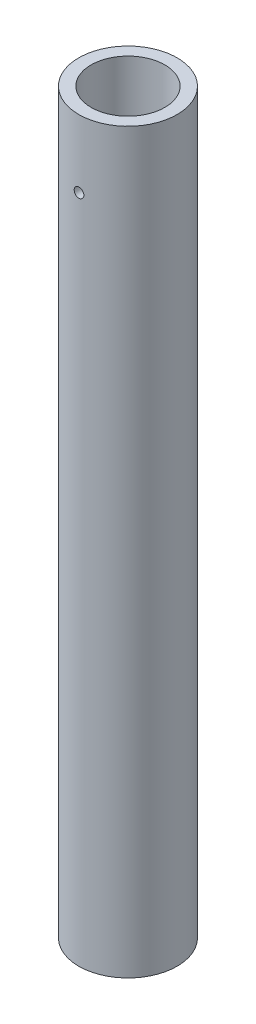
ISO-10303-21;
HEADER;
FILE_DESCRIPTION(('STEP AP214'),'2;1');
FILE_NAME('part.step','',(''),(''),'','','');
FILE_SCHEMA(('AUTOMOTIVE_DESIGN { 1 0 10303 214 1 1 1 1 }'));
ENDSEC;
DATA;
#1=APPLICATION_CONTEXT('core data for automotive mechanical design processes');
#2=APPLICATION_PROTOCOL_DEFINITION('international standard','automotive_design',2000,#1);
#3=PRODUCT_CONTEXT('',#1,'mechanical');
#4=PRODUCT('Part','Part','',(#3));
#5=PRODUCT_RELATED_PRODUCT_CATEGORY('part','',(#4));
#6=PRODUCT_DEFINITION_FORMATION('','',#4);
#7=PRODUCT_DEFINITION_CONTEXT('part definition',#1,'design');
#8=PRODUCT_DEFINITION('design','',#6,#7);
#9=PRODUCT_DEFINITION_SHAPE('','',#8);
#10=(LENGTH_UNIT() NAMED_UNIT(*) SI_UNIT(.MILLI.,.METRE.));
#11=(NAMED_UNIT(*) PLANE_ANGLE_UNIT() SI_UNIT($,.RADIAN.));
#12=(NAMED_UNIT(*) SI_UNIT($,.STERADIAN.) SOLID_ANGLE_UNIT());
#13=UNCERTAINTY_MEASURE_WITH_UNIT(LENGTH_MEASURE(1.E-05),#10,'distance_accuracy_value','');
#14=(GEOMETRIC_REPRESENTATION_CONTEXT(3) GLOBAL_UNCERTAINTY_ASSIGNED_CONTEXT((#13)) GLOBAL_UNIT_ASSIGNED_CONTEXT((#10,
#11,#12)) REPRESENTATION_CONTEXT('',''));
#15=CARTESIAN_POINT('',(0.,0.,0.));
#16=DIRECTION('',(0.,0.,1.));
#17=DIRECTION('',(1.,0.,0.));
#18=AXIS2_PLACEMENT_3D('',#15,#16,#17);
#19=CARTESIAN_POINT('',(0.,152.4,0.));
#20=DIRECTION('',(0.,1.,0.));
#21=DIRECTION('',(0.,0.,1.));
#22=AXIS2_PLACEMENT_3D('',#19,#20,#21);
#23=PLANE('',#22);
#24=CARTESIAN_POINT('',(0.,152.4,0.));
#25=DIRECTION('',(0.,1.,0.));
#26=DIRECTION('',(0.,0.,1.));
#27=AXIS2_PLACEMENT_3D('',#24,#25,#26);
#28=CIRCLE('',#27,10.16);
#29=CARTESIAN_POINT('',(0.,152.4,10.16));
#30=VERTEX_POINT('',#29);
#31=EDGE_CURVE('E158',#30,#30,#28,.T.);
#32=ORIENTED_EDGE('',*,*,#31,.T.);
#33=EDGE_LOOP('',(#32));
#34=FACE_BOUND('',#33,.T.);
#35=CARTESIAN_POINT('',(0.,152.4,0.));
#36=DIRECTION('',(0.,1.,0.));
#37=DIRECTION('',(0.,0.,1.));
#38=AXIS2_PLACEMENT_3D('',#35,#36,#37);
#39=CIRCLE('',#38,7.62);
#40=CARTESIAN_POINT('',(0.,152.4,7.62));
#41=VERTEX_POINT('',#40);
#42=EDGE_CURVE('E168',#41,#41,#39,.T.);
#43=ORIENTED_EDGE('',*,*,#42,.F.);
#44=EDGE_LOOP('',(#43));
#45=FACE_BOUND('',#44,.T.);
#46=ADVANCED_FACE('F42',(#34,#45),#23,.T.);
#47=CARTESIAN_POINT('',(0.,0.,0.));
#48=DIRECTION('',(0.,1.,0.));
#49=DIRECTION('',(0.,0.,1.));
#50=AXIS2_PLACEMENT_3D('',#47,#48,#49);
#51=PLANE('',#50);
#52=CARTESIAN_POINT('',(0.,0.,0.));
#53=DIRECTION('',(0.,1.,0.));
#54=DIRECTION('',(0.,0.,1.));
#55=AXIS2_PLACEMENT_3D('',#52,#53,#54);
#56=CIRCLE('',#55,10.16);
#57=CARTESIAN_POINT('',(0.,0.,10.16));
#58=VERTEX_POINT('',#57);
#59=EDGE_CURVE('E164',#58,#58,#56,.T.);
#60=ORIENTED_EDGE('',*,*,#59,.F.);
#61=EDGE_LOOP('',(#60));
#62=FACE_BOUND('',#61,.T.);
#63=CARTESIAN_POINT('',(0.,0.,0.));
#64=DIRECTION('',(0.,1.,0.));
#65=DIRECTION('',(0.,0.,1.));
#66=AXIS2_PLACEMENT_3D('',#63,#64,#65);
#67=CIRCLE('',#66,7.62);
#68=CARTESIAN_POINT('',(0.,0.,7.62));
#69=VERTEX_POINT('',#68);
#70=EDGE_CURVE('E171',#69,#69,#67,.T.);
#71=ORIENTED_EDGE('',*,*,#70,.T.);
#72=EDGE_LOOP('',(#71));
#73=FACE_BOUND('',#72,.T.);
#74=ADVANCED_FACE('F180',(#62,#73),#51,.F.);
#75=CARTESIAN_POINT('',(0.,152.4,0.));
#76=DIRECTION('',(0.,-1.,0.));
#77=DIRECTION('',(0.,0.,-1.));
#78=AXIS2_PLACEMENT_3D('',#75,#76,#77);
#79=CYLINDRICAL_SURFACE('',#78,10.16);
#80=DIRECTION('',(0.,-1.,0.));
#81=VECTOR('',#80,1.);
#82=CARTESIAN_POINT('',(2.53999999999999,152.4,-9.83737769936684));
#83=LINE('',#82,#81);
#84=CARTESIAN_POINT('',(2.54,45.0577550256016,-9.83737769936684));
#85=VERTEX_POINT('',#84);
#86=CARTESIAN_POINT('',(2.54,70.4577550256015,-9.83737769936684));
#87=VERTEX_POINT('',#86);
#88=EDGE_CURVE('E92',#85,#87,#83,.F.);
#89=ORIENTED_EDGE('',*,*,#88,.T.);
#90=CARTESIAN_POINT('',(0.,70.4577550256015,0.));
#91=DIRECTION('',(0.,1.,0.));
#92=DIRECTION('',(0.,0.,1.));
#93=AXIS2_PLACEMENT_3D('',#90,#91,#92);
#94=CIRCLE('',#93,10.16);
#95=CARTESIAN_POINT('',(-2.54,70.4577550256015,-9.83737769936684));
#96=VERTEX_POINT('',#95);
#97=EDGE_CURVE('E104',#87,#96,#94,.T.);
#98=ORIENTED_EDGE('',*,*,#97,.T.);
#99=DIRECTION('',(0.,-1.,0.));
#100=VECTOR('',#99,1.);
#101=CARTESIAN_POINT('',(-2.53999999999999,152.4,-9.83737769936684));
#102=LINE('',#101,#100);
#103=CARTESIAN_POINT('',(-2.54,45.0577550256016,-9.83737769936684));
#104=VERTEX_POINT('',#103);
#105=EDGE_CURVE('E98',#96,#104,#102,.T.);
#106=ORIENTED_EDGE('',*,*,#105,.T.);
#107=CARTESIAN_POINT('',(0.,45.0577550256016,0.));
#108=DIRECTION('',(0.,-1.,0.));
#109=DIRECTION('',(0.,0.,-1.));
#110=AXIS2_PLACEMENT_3D('',#107,#108,#109);
#111=CIRCLE('',#110,10.16);
#112=EDGE_CURVE('E83',#104,#85,#111,.T.);
#113=ORIENTED_EDGE('',*,*,#112,.T.);
#114=EDGE_LOOP('',(#89,#98,#106,#113));
#115=FACE_BOUND('',#114,.T.);
#116=CARTESIAN_POINT('',(0.,139.43,-10.16));
#117=CARTESIAN_POINT('',(-0.0560250261157726,139.429997571628,-10.1599993643014));
#118=CARTESIAN_POINT('',(-0.112087205430035,139.425275944608,-10.1595316682345));
#119=CARTESIAN_POINT('',(-0.222657622275252,139.406511546825,-10.1577109084441));
#120=CARTESIAN_POINT('',(-0.277164073361569,139.392458477049,-10.1563568664937));
#121=CARTESIAN_POINT('',(-0.383005831709282,139.355443983099,-10.1529162789638));
#122=CARTESIAN_POINT('',(-0.434343020475558,139.332487904516,-10.1508301730054));
#123=CARTESIAN_POINT('',(-0.532424286024198,139.278329326082,-10.1461587902314));
#124=CARTESIAN_POINT('',(-0.579169280632964,139.247128478704,-10.143573613471));
#125=CARTESIAN_POINT('',(-0.66691376112447,139.177249059511,-10.1381836351593));
#126=CARTESIAN_POINT('',(-0.707894966705325,139.138547582446,-10.1353781769401));
#127=CARTESIAN_POINT('',(-0.782791472996865,139.054814310853,-10.1298692664587));
#128=CARTESIAN_POINT('',(-0.816706448607081,139.00978222523,-10.1271658188946));
#129=CARTESIAN_POINT('',(-0.876572239315846,138.914551978713,-10.1221602761381));
#130=CARTESIAN_POINT('',(-0.902506558443179,138.864343400069,-10.1198590164493));
#131=CARTESIAN_POINT('',(-0.945569519703623,138.760257678527,-10.115926483827));
#132=CARTESIAN_POINT('',(-0.962698373017576,138.706380623646,-10.114295194826));
#133=CARTESIAN_POINT('',(-0.987610096586675,138.596673444315,-10.1118931970649));
#134=CARTESIAN_POINT('',(-0.995423234589245,138.540850254936,-10.1111197018178));
#135=CARTESIAN_POINT('',(-1.00157529857259,138.428679916967,-10.1105122022756));
#136=CARTESIAN_POINT('',(-0.999914466277741,138.372332781782,-10.1106781740105));
#137=CARTESIAN_POINT('',(-0.987190689058772,138.260922561255,-10.1119283125346));
#138=CARTESIAN_POINT('',(-0.976160776776338,138.205855662084,-10.1130092533631));
#139=CARTESIAN_POINT('',(-0.945063328277174,138.098358463532,-10.1159624936836));
#140=CARTESIAN_POINT('',(-0.92499567341003,138.045928198777,-10.1178348035648));
#141=CARTESIAN_POINT('',(-0.876355871770824,137.945088130312,-10.1221635314666));
#142=CARTESIAN_POINT('',(-0.847769052703529,137.896685448676,-10.1246209557318));
#143=CARTESIAN_POINT('',(-0.782912944205676,137.805352451354,-10.1298421629858));
#144=CARTESIAN_POINT('',(-0.746643436988559,137.762422290857,-10.1326059546583));
#145=CARTESIAN_POINT('',(-0.667266935808773,137.683061002315,-10.1381428586994));
#146=CARTESIAN_POINT('',(-0.624131411076059,137.646658403674,-10.1409159604841));
#147=CARTESIAN_POINT('',(-0.532346452083306,137.581606644803,-10.1461478722502));
#148=CARTESIAN_POINT('',(-0.483697011930568,137.552957492859,-10.1486066818957));
#149=CARTESIAN_POINT('',(-0.382245559787237,137.504227080501,-10.152933739007));
#150=CARTESIAN_POINT('',(-0.329442857077843,137.484147248812,-10.154801887981));
#151=CARTESIAN_POINT('',(-0.221192992155678,137.453146283328,-10.1577361159729));
#152=CARTESIAN_POINT('',(-0.165745906595768,137.442224884228,-10.1588022182249));
#153=CARTESIAN_POINT('',(-0.0540283040116495,137.429886952227,-10.1600092469116));
#154=CARTESIAN_POINT('',(0.00223782510741885,137.428431046945,-10.1601540056859));
#155=CARTESIAN_POINT('',(0.114213296595047,137.434962047263,-10.1595123089037));
#156=CARTESIAN_POINT('',(0.169922646237134,137.442948829344,-10.1587258655282));
#157=CARTESIAN_POINT('',(0.279089675299401,137.468105828399,-10.1563126020596));
#158=CARTESIAN_POINT('',(0.332551639022963,137.485257629292,-10.1546874674458));
#159=CARTESIAN_POINT('',(0.435839434129006,137.528238875258,-10.1507791649535));
#160=CARTESIAN_POINT('',(0.485665186377301,137.554068509116,-10.1484959827593));
#161=CARTESIAN_POINT('',(0.580444321850738,137.613769988661,-10.1435174846501));
#162=CARTESIAN_POINT('',(0.625381326597634,137.647667724463,-10.1408208521173));
#163=CARTESIAN_POINT('',(0.708941626585569,137.722506025058,-10.1353223279493));
#164=CARTESIAN_POINT('',(0.747564768343615,137.763446761008,-10.1325204337574));
#165=CARTESIAN_POINT('',(0.817537510244529,137.851380602453,-10.1271156660811));
#166=CARTESIAN_POINT('',(0.848861285245363,137.898394309157,-10.1245135204383));
#167=CARTESIAN_POINT('',(0.903168639474859,137.997037837922,-10.1198138614828));
#168=CARTESIAN_POINT('',(0.926152329664966,138.048667598557,-10.1177163414563));
#169=CARTESIAN_POINT('',(0.963083780642945,138.154988795494,-10.1142679139783));
#170=CARTESIAN_POINT('',(0.977046952614755,138.209674835616,-10.1129157337279));
#171=CARTESIAN_POINT('',(0.995591025077967,138.320629230264,-10.1111070959364));
#172=CARTESIAN_POINT('',(1.00017218549786,138.376897540911,-10.11065061358));
#173=CARTESIAN_POINT('',(0.999818647500243,138.489162544836,-10.1106855606105));
#174=CARTESIAN_POINT('',(0.994924517879189,138.545159371555,-10.1111729487841));
#175=CARTESIAN_POINT('',(0.97584433948834,138.655531266459,-10.1130321064371));
#176=CARTESIAN_POINT('',(0.961658279838914,138.709906332744,-10.1144038769521));
#177=CARTESIAN_POINT('',(0.924408033562373,138.815491188644,-10.1178761196795));
#178=CARTESIAN_POINT('',(0.901344991743544,138.866701385424,-10.1199764979246));
#179=CARTESIAN_POINT('',(0.846999671719266,138.964530274758,-10.1246694842275));
#180=CARTESIAN_POINT('',(0.815717447961337,139.011148997725,-10.1272620890245));
#181=CARTESIAN_POINT('',(0.745669361165865,139.098679504877,-10.1326606952461));
#182=CARTESIAN_POINT('',(0.706873281046854,139.139567056382,-10.1354675296104));
#183=CARTESIAN_POINT('',(0.62295817324678,139.214269716208,-10.1409707252067));
#184=CARTESIAN_POINT('',(0.577837631731866,139.248083126407,-10.143667059789));
#185=CARTESIAN_POINT('',(0.482434060568177,139.307742325493,-10.14865227399));
#186=CARTESIAN_POINT('',(0.432138655203265,139.333568393282,-10.1509401392909));
#187=CARTESIAN_POINT('',(0.327934982854715,139.376374329197,-10.1548395327825));
#188=CARTESIAN_POINT('',(0.274030875693196,139.393364191362,-10.156451824666));
#189=CARTESIAN_POINT('',(0.183183572421568,139.413769724559,-10.1584123937964));
#190=CARTESIAN_POINT('',(0.146821484764042,139.419847785046,-10.1590049766582));
#191=CARTESIAN_POINT('',(0.0736449489982818,139.427963712955,-10.1597989879367));
#192=CARTESIAN_POINT('',(0.0368305026841016,139.430001596397,-10.1600004179043));
#193=CARTESIAN_POINT('',(0.,139.43,-10.16));
#194=B_SPLINE_CURVE_WITH_KNOTS('',3,(#116,#117,#118,#119,#120,#121,#122,#123,#124,#125,#126,
#127,#128,#129,#130,#131,#132,#133,#134,#135,#136,#137,#138,#139,#140,#141,#142,#143,#144,#145,
#146,#147,#148,#149,#150,#151,#152,#153,#154,#155,#156,#157,#158,#159,#160,#161,#162,#163,#164,
#165,#166,#167,#168,#169,#170,#171,#172,#173,#174,#175,#176,#177,#178,#179,#180,#181,#182,#183,
#184,#185,#186,#187,#188,#189,#190,#191,#192,#193),.UNSPECIFIED.,.T.,.F.,(4,2,2,2,2,2,2,2,2,2,2,
2,2,2,2,2,2,2,2,2,2,2,2,2,2,2,2,2,2,2,2,2,2,2,2,2,2,2,4),(0.,0.167940589123231,
0.336066841243115,0.504092302011024,0.672084111478312,0.840597252386842,1.00911814447386,
1.17798506411701,1.34684793364823,1.51516064155162,1.68346905504605,1.85118651354686,
2.01890617396106,2.1869163788055,2.35493134699083,2.52366363613476,2.69239610560393,
2.86115669612612,3.02991239774617,3.19796569670965,3.36601679742049,3.53373148112657,
3.70144981368796,3.86971377933968,4.03798183469339,4.20683647739534,4.37568887347241,
4.54425202389634,4.71281050421748,4.88064889108516,5.04848747446993,5.21630442002179,
5.38412025390751,5.55262552631786,5.72117120153371,5.89012976099866,6.05889680490191,
6.16930033829627,6.2797034339716),.UNSPECIFIED.);
#195=CARTESIAN_POINT('',(0.,139.43,-10.16));
#196=VERTEX_POINT('',#195);
#197=EDGE_CURVE('E124',#196,#196,#194,.T.);
#198=ORIENTED_EDGE('',*,*,#197,.T.);
#199=EDGE_LOOP('',(#198));
#200=FACE_BOUND('',#199,.T.);
#201=CARTESIAN_POINT('',(1.,138.43,10.1106676337421));
#202=CARTESIAN_POINT('',(0.999997570964828,138.373975714991,10.110668281003));
#203=CARTESIAN_POINT('',(0.995276064639579,138.317914274448,10.1111383064391));
#204=CARTESIAN_POINT('',(0.976512189845636,138.207345392564,10.1129673870779));
#205=CARTESIAN_POINT('',(0.962459519801134,138.152839738249,10.1143274248275));
#206=CARTESIAN_POINT('',(0.92544619518906,138.04699966469,10.1177810172928));
#207=CARTESIAN_POINT('',(0.902490905220281,137.995663357195,10.119874130194));
#208=CARTESIAN_POINT('',(0.848334183923257,137.897583568281,10.1245574871434));
#209=CARTESIAN_POINT('',(0.817134403131882,137.850839170134,10.1271476316582));
#210=CARTESIAN_POINT('',(0.747256061372233,137.763094016167,10.1325434435781));
#211=CARTESIAN_POINT('',(0.708554356863951,137.722111729564,10.135349761306));
#212=CARTESIAN_POINT('',(0.624820176486221,137.647213136871,10.1408558096618));
#213=CARTESIAN_POINT('',(0.579787412469955,137.613297152566,10.1435555354313));
#214=CARTESIAN_POINT('',(0.484556571520478,137.553430307023,10.1485506115151));
#215=CARTESIAN_POINT('',(0.434348193495006,137.527495756511,10.1508451297318));
#216=CARTESIAN_POINT('',(0.330262907993588,137.484432312127,10.15476419046));
#217=CARTESIAN_POINT('',(0.276386087390337,137.467303209814,10.1563887488304));
#218=CARTESIAN_POINT('',(0.166679625462924,137.442390965994,10.1587802836007));
#219=CARTESIAN_POINT('',(0.110856923851709,137.434577534946,10.1595500387968));
#220=CARTESIAN_POINT('',(-0.00131245906715127,137.428424715871,10.1601546837203));
#221=CARTESIAN_POINT('',(-0.0576591271455157,137.430085089293,10.1599895969874));
#222=CARTESIAN_POINT('',(-0.16907137169185,137.44280814013,10.1587454352505));
#223=CARTESIAN_POINT('',(-0.224140707963778,137.453838246819,10.1576695264573));
#224=CARTESIAN_POINT('',(-0.331642680347676,137.48493692894,10.1547282843798));
#225=CARTESIAN_POINT('',(-0.384075283119546,137.505005618629,10.1528629411162));
#226=CARTESIAN_POINT('',(-0.484918185285209,137.553647562684,10.1485471175276));
#227=CARTESIAN_POINT('',(-0.533321479772593,137.582235247862,10.1460956457302));
#228=CARTESIAN_POINT('',(-0.624655335452682,137.647093204765,10.1408826826693));
#229=CARTESIAN_POINT('',(-0.667585741133459,137.68336369472,10.1381211826006));
#230=CARTESIAN_POINT('',(-0.746945919156155,137.762740892785,10.1325842871487));
#231=CARTESIAN_POINT('',(-0.783347360534838,137.805875931068,10.1298088824898));
#232=CARTESIAN_POINT('',(-0.848397016281653,137.897659504526,10.1245686762412));
#233=CARTESIAN_POINT('',(-0.877045219971192,137.946308047295,10.1221038750793));
#234=CARTESIAN_POINT('',(-0.92577495025555,138.047759256763,10.1177636994647));
#235=CARTESIAN_POINT('',(-0.945854755209398,138.100562755792,10.1158884434886));
#236=CARTESIAN_POINT('',(-0.976855423183823,138.208814351553,10.1129421103262));
#237=CARTESIAN_POINT('',(-0.987776556339186,138.264262370235,10.1118710094214));
#238=CARTESIAN_POINT('',(-1.00011348534043,138.375980406209,10.1106583372417));
#239=CARTESIAN_POINT('',(-1.00156890321322,138.432246007734,10.1105128913723));
#240=CARTESIAN_POINT('',(-0.995037116398812,138.544220306927,10.1111577717627));
#241=CARTESIAN_POINT('',(-0.987050035243166,138.599929011871,10.1119480857803));
#242=CARTESIAN_POINT('',(-0.961893112001501,138.709092837478,10.1143719111197));
#243=CARTESIAN_POINT('',(-0.944741979841089,138.762552311268,10.1160037041869));
#244=CARTESIAN_POINT('',(-0.901762905281787,138.865835422383,10.1199252271251));
#245=CARTESIAN_POINT('',(-0.875934770153886,138.915658978919,10.1222149716101));
#246=CARTESIAN_POINT('',(-0.816235496287116,139.010436618805,10.1272037799682));
#247=CARTESIAN_POINT('',(-0.782338086668079,139.055374083554,10.1299041701726));
#248=CARTESIAN_POINT('',(-0.707500170442365,139.138935463612,10.135405646598));
#249=CARTESIAN_POINT('',(-0.666559494916174,139.177559227454,10.1382067352328));
#250=CARTESIAN_POINT('',(-0.578625381792137,139.247533312962,10.1436056744198));
#251=CARTESIAN_POINT('',(-0.53161133227703,139.27885779761,10.1462027820774));
#252=CARTESIAN_POINT('',(-0.432966928723687,139.333166396974,10.1508903294878));
#253=CARTESIAN_POINT('',(-0.381336636228308,139.35615062286,10.1529807759939));
#254=CARTESIAN_POINT('',(-0.275015775554055,139.393082428245,10.1564161015189));
#255=CARTESIAN_POINT('',(-0.220330684634552,139.407045651039,10.1577622705992));
#256=CARTESIAN_POINT('',(-0.109378291822723,139.425590146784,10.1595626515228));
#257=CARTESIAN_POINT('',(-0.0531110329523592,139.430171674591,10.1600168875955));
#258=CARTESIAN_POINT('',(0.0591546020874664,139.429819208076,10.1599822149915));
#259=CARTESIAN_POINT('',(0.115153109791673,139.424925339131,10.1594972833972));
#260=CARTESIAN_POINT('',(0.225528431743147,139.405845090741,10.1576466125197));
#261=CARTESIAN_POINT('',(0.27990524460995,139.391658703387,10.1562808724865));
#262=CARTESIAN_POINT('',(0.385493600596397,139.354407142975,10.1528216280234));
#263=CARTESIAN_POINT('',(0.436705545235127,139.331343098899,10.1507282161354));
#264=CARTESIAN_POINT('',(0.534537512032109,139.276995233263,10.1460470677646));
#265=CARTESIAN_POINT('',(0.58115756568689,139.24571146809,10.1434593346726));
#266=CARTESIAN_POINT('',(0.668687995355574,139.175661685889,10.1380664001795));
#267=CARTESIAN_POINT('',(0.709574419702928,139.136865804323,10.1352603584505));
#268=CARTESIAN_POINT('',(0.784274898130873,139.052951557415,10.1297541793632));
#269=CARTESIAN_POINT('',(0.818087251135238,139.007831675709,10.127054067604));
#270=CARTESIAN_POINT('',(0.877745312374378,138.912428642218,10.1220583064397));
#271=CARTESIAN_POINT('',(0.903571109634263,138.862132995981,10.1197636739205));
#272=CARTESIAN_POINT('',(0.946376473049119,138.757928812729,10.1158508202713));
#273=CARTESIAN_POINT('',(0.963366036924972,138.704024437116,10.1142318350947));
#274=CARTESIAN_POINT('',(0.983770729701178,138.61317793188,10.1122626965649));
#275=CARTESIAN_POINT('',(0.98984841192421,138.576816970115,10.1116673685919));
#276=CARTESIAN_POINT('',(0.99796383732898,138.503642689957,10.1108696252239));
#277=CARTESIAN_POINT('',(1.00000159680473,138.466829373388,10.1106672082442));
#278=CARTESIAN_POINT('',(1.,138.43,10.1106676337421));
#279=B_SPLINE_CURVE_WITH_KNOTS('',3,(#201,#202,#203,#204,#205,#206,#207,#208,#209,#210,#211,
#212,#213,#214,#215,#216,#217,#218,#219,#220,#221,#222,#223,#224,#225,#226,#227,#228,#229,#230,
#231,#232,#233,#234,#235,#236,#237,#238,#239,#240,#241,#242,#243,#244,#245,#246,#247,#248,#249,
#250,#251,#252,#253,#254,#255,#256,#257,#258,#259,#260,#261,#262,#263,#264,#265,#266,#267,#268,
#269,#270,#271,#272,#273,#274,#275,#276,#277,#278),.UNSPECIFIED.,.T.,.F.,(4,2,2,2,2,2,2,2,2,2,2,
2,2,2,2,2,2,2,2,2,2,2,2,2,2,2,2,2,2,2,2,2,2,2,2,2,2,2,4),(0.,0.167938363022242,
0.336062438416939,0.504085361526901,0.67207467210659,0.840590726110466,1.00911445230471,
1.17798031827881,1.34684218671617,1.51515349685862,1.68346056889707,1.8511849609762,
2.01891147330864,2.18692373801036,2.35494077571062,2.52367011979546,2.69239969627136,
2.86116315948999,3.02992164485961,3.197973276048,3.36602270872429,3.53373034442673,
3.70144170540903,3.8697067319582,4.03797579459095,4.2068317205813,4.37568539575266,
4.54424547067235,4.71280096656751,4.88064424293947,5.04848766218362,5.21630974364397,
5.38413067390515,5.55263300976452,5.72117581831452,5.89013548866277,6.0589035720951,
6.16930372486948,6.27970343237164),.UNSPECIFIED.);
#280=CARTESIAN_POINT('',(1.,138.43,10.1106676337421));
#281=VERTEX_POINT('',#280);
#282=EDGE_CURVE('E116',#281,#281,#279,.T.);
#283=ORIENTED_EDGE('',*,*,#282,.T.);
#284=EDGE_LOOP('',(#283));
#285=FACE_BOUND('',#284,.T.);
#286=ORIENTED_EDGE('',*,*,#31,.F.);
#287=EDGE_LOOP('',(#286));
#288=FACE_BOUND('',#287,.T.);
#289=ORIENTED_EDGE('',*,*,#59,.T.);
#290=EDGE_LOOP('',(#289));
#291=FACE_BOUND('',#290,.T.);
#292=ADVANCED_FACE('F44',(#115,#200,#285,#288,#291),#79,.T.);
#293=CARTESIAN_POINT('',(0.,152.4,0.));
#294=DIRECTION('',(0.,-1.,0.));
#295=DIRECTION('',(0.,0.,-1.));
#296=AXIS2_PLACEMENT_3D('',#293,#294,#295);
#297=CYLINDRICAL_SURFACE('',#296,7.62);
#298=DIRECTION('',(0.,-1.,0.));
#299=VECTOR('',#298,1.);
#300=CARTESIAN_POINT('',(-2.53999999999999,152.4,-7.18420489685532));
#301=LINE('',#300,#299);
#302=CARTESIAN_POINT('',(-2.54,70.4577550256015,-7.18420489685532));
#303=VERTEX_POINT('',#302);
#304=CARTESIAN_POINT('',(-2.54,45.0577550256016,-7.18420489685532));
#305=VERTEX_POINT('',#304);
#306=EDGE_CURVE('E11',#303,#305,#301,.T.);
#307=ORIENTED_EDGE('',*,*,#306,.F.);
#308=CARTESIAN_POINT('',(0.,70.4577550256015,0.));
#309=DIRECTION('',(0.,1.,0.));
#310=DIRECTION('',(0.,0.,1.));
#311=AXIS2_PLACEMENT_3D('',#308,#309,#310);
#312=CIRCLE('',#311,7.62);
#313=CARTESIAN_POINT('',(2.54,70.4577550256015,-7.18420489685532));
#314=VERTEX_POINT('',#313);
#315=EDGE_CURVE('E52',#314,#303,#312,.T.);
#316=ORIENTED_EDGE('',*,*,#315,.F.);
#317=DIRECTION('',(0.,-1.,0.));
#318=VECTOR('',#317,1.);
#319=CARTESIAN_POINT('',(2.53999999999999,152.4,-7.18420489685532));
#320=LINE('',#319,#318);
#321=CARTESIAN_POINT('',(2.54,45.0577550256016,-7.18420489685532));
#322=VERTEX_POINT('',#321);
#323=EDGE_CURVE('E157',#322,#314,#320,.F.);
#324=ORIENTED_EDGE('',*,*,#323,.F.);
#325=CARTESIAN_POINT('',(0.,45.0577550256016,0.));
#326=DIRECTION('',(0.,-1.,0.));
#327=DIRECTION('',(0.,0.,-1.));
#328=AXIS2_PLACEMENT_3D('',#325,#326,#327);
#329=CIRCLE('',#328,7.62);
#330=EDGE_CURVE('E154',#305,#322,#329,.T.);
#331=ORIENTED_EDGE('',*,*,#330,.F.);
#332=EDGE_LOOP('',(#307,#316,#324,#331));
#333=FACE_BOUND('',#332,.T.);
#334=CARTESIAN_POINT('',(0.,139.43,-7.62));
#335=CARTESIAN_POINT('',(-0.0559126756160629,139.429997639455,-7.61999918877596));
#336=CARTESIAN_POINT('',(-0.111859711548277,139.425294843089,-7.61937811313407));
#337=CARTESIAN_POINT('',(-0.222195342279642,139.406609624874,-7.6169602671398));
#338=CARTESIAN_POINT('',(-0.276582275341594,139.392617665572,-7.6151622884536));
#339=CARTESIAN_POINT('',(-0.382184521593468,139.355774854592,-7.61059307237028));
#340=CARTESIAN_POINT('',(-0.433402002664986,139.332930137572,-7.60782250906593));
#341=CARTESIAN_POINT('',(-0.531267011820699,139.279044089506,-7.60161580046524));
#342=CARTESIAN_POINT('',(-0.577915287132399,139.248004101757,-7.59817976427192));
#343=CARTESIAN_POINT('',(-0.665608923275433,139.178408240771,-7.59100216329937));
#344=CARTESIAN_POINT('',(-0.706622681360308,139.139812702466,-7.58725904944326));
#345=CARTESIAN_POINT('',(-0.781610759959446,139.056286554385,-7.57990156905773));
#346=CARTESIAN_POINT('',(-0.8155847114813,139.011355612746,-7.57628720928519));
#347=CARTESIAN_POINT('',(-0.875647806285741,138.916226989494,-7.56958129037963));
#348=CARTESIAN_POINT('',(-0.901707103787682,138.866010310622,-7.56649172906423));
#349=CARTESIAN_POINT('',(-0.945010533173226,138.761865961551,-7.56120584767504));
#350=CARTESIAN_POINT('',(-0.962255032926766,138.707938446323,-7.55900949032577));
#351=CARTESIAN_POINT('',(-0.987342801591459,138.598232361073,-7.5557736133037));
#352=CARTESIAN_POINT('',(-0.995239624177788,138.54246623552,-7.55472750622457));
#353=CARTESIAN_POINT('',(-1.00157363511942,138.430391229976,-7.55389045885046));
#354=CARTESIAN_POINT('',(-1.0000112415198,138.374082374082,-7.55409946308649));
#355=CARTESIAN_POINT('',(-0.987515085378044,138.262894708661,-7.5557429952851));
#356=CARTESIAN_POINT('',(-0.976640465223454,138.208009121616,-7.55716978882333));
#357=CARTESIAN_POINT('',(-0.945920893997553,138.100848591819,-7.56107606924086));
#358=CARTESIAN_POINT('',(-0.926075744256178,138.048573706916,-7.56355557943458));
#359=CARTESIAN_POINT('',(-0.877915357126104,137.947935624028,-7.56929663333329));
#360=CARTESIAN_POINT('',(-0.849574570750678,137.899584792226,-7.57256052997345));
#361=CARTESIAN_POINT('',(-0.785245658531025,137.808302879064,-7.57950080899972));
#362=CARTESIAN_POINT('',(-0.749257147371444,137.765372070956,-7.58317721216475));
#363=CARTESIAN_POINT('',(-0.670327324984674,137.68580568893,-7.59056260239773));
#364=CARTESIAN_POINT('',(-0.627335065484845,137.649220639946,-7.59427162407576));
#365=CARTESIAN_POINT('',(-0.53579314428028,137.583778202203,-7.60127814448871));
#366=CARTESIAN_POINT('',(-0.487243467427241,137.554920834508,-7.60457564210186));
#367=CARTESIAN_POINT('',(-0.385924771580164,137.505752283934,-7.61038992553526));
#368=CARTESIAN_POINT('',(-0.333154115933255,137.485444435368,-7.61290640665849));
#369=CARTESIAN_POINT('',(-0.224911346367332,137.45399238165,-7.61687241446963));
#370=CARTESIAN_POINT('',(-0.169439372092165,137.442847703341,-7.61832199624827));
#371=CARTESIAN_POINT('',(-0.0578052863544264,137.430104225938,-7.61998368521743));
#372=CARTESIAN_POINT('',(-0.00165124535425105,137.428435859098,-7.62020481052105));
#373=CARTESIAN_POINT('',(0.110135664750075,137.434508525564,-7.6194090668302));
#374=CARTESIAN_POINT('',(0.165768546084707,137.442249337497,-7.61839222696179));
#375=CARTESIAN_POINT('',(0.274727382147888,137.466862819301,-7.61524041145274));
#376=CARTESIAN_POINT('',(0.328060996306338,137.483702149881,-7.61310951890283));
#377=CARTESIAN_POINT('',(0.431147434422157,137.525999885268,-7.60796805660169));
#378=CARTESIAN_POINT('',(0.480900125511568,137.551458609694,-7.60495745423032));
#379=CARTESIAN_POINT('',(0.575722006489984,137.610439576636,-7.59836947697977));
#380=CARTESIAN_POINT('',(0.620763110944,137.644006617828,-7.5947889923447));
#381=CARTESIAN_POINT('',(0.704597116435586,137.718188232059,-7.58747105909336));
#382=CARTESIAN_POINT('',(0.743389742906008,137.758803114628,-7.58373360358866));
#383=CARTESIAN_POINT('',(0.813873914906321,137.846234726141,-7.57649495650589));
#384=CARTESIAN_POINT('',(0.845519221426591,137.893088886614,-7.57299540033099));
#385=CARTESIAN_POINT('',(0.900490567065849,137.991488221252,-7.56665617497988));
#386=CARTESIAN_POINT('',(0.923816787126013,138.043033293359,-7.56381649145181));
#387=CARTESIAN_POINT('',(0.961413692161374,138.149204723083,-7.55912984940613));
#388=CARTESIAN_POINT('',(0.9757100411757,138.203821863251,-7.55728007973718));
#389=CARTESIAN_POINT('',(0.994923823468183,138.314707535444,-7.55477478312474));
#390=CARTESIAN_POINT('',(0.999841741478126,138.370975981967,-7.55411919445912));
#391=CARTESIAN_POINT('',(1.00014955077465,138.483106817409,-7.55407840933602));
#392=CARTESIAN_POINT('',(0.995612095498835,138.538969017201,-7.55468352583262));
#393=CARTESIAN_POINT('',(0.977292240038751,138.649129265053,-7.55707509082884));
#394=CARTESIAN_POINT('',(0.963509842125451,138.703427313496,-7.55886153903827));
#395=CARTESIAN_POINT('',(0.927114760883023,138.808905891921,-7.56341139239511));
#396=CARTESIAN_POINT('',(0.904505949795902,138.86008777763,-7.56617436907877));
#397=CARTESIAN_POINT('',(0.851106962855697,138.957943172257,-7.5723666209024));
#398=CARTESIAN_POINT('',(0.820316643271973,139.004616601952,-7.57579590774766));
#399=CARTESIAN_POINT('',(0.751160342867072,139.092501117147,-7.58296591825009));
#400=CARTESIAN_POINT('',(0.712740275174442,139.133669473322,-7.5867087482423));
#401=CARTESIAN_POINT('',(0.629528514909789,139.209001931665,-7.59406575418237));
#402=CARTESIAN_POINT('',(0.584735327864502,139.243164386374,-7.59767989970496));
#403=CARTESIAN_POINT('',(0.489832172674815,139.303638729119,-7.60438919338931));
#404=CARTESIAN_POINT('',(0.439700736874184,139.329917161824,-7.60748210608752));
#405=CARTESIAN_POINT('',(0.335722678752545,139.373644211547,-7.61277802806039));
#406=CARTESIAN_POINT('',(0.281880120782511,139.391102319146,-7.61498199331615));
#407=CARTESIAN_POINT('',(0.189806014834394,139.412564595331,-7.61772690949831));
#408=CARTESIAN_POINT('',(0.152152450086221,139.419093339156,-7.61857511392121));
#409=CARTESIAN_POINT('',(0.0763379270879741,139.427811829074,-7.61971193376205));
#410=CARTESIAN_POINT('',(0.0381769731211439,139.430001611772,-7.62000055390085));
#411=CARTESIAN_POINT('',(0.,139.43,-7.62));
#412=B_SPLINE_CURVE_WITH_KNOTS('',3,(#334,#335,#336,#337,#338,#339,#340,#341,#342,#343,#344,
#345,#346,#347,#348,#349,#350,#351,#352,#353,#354,#355,#356,#357,#358,#359,#360,#361,#362,#363,
#364,#365,#366,#367,#368,#369,#370,#371,#372,#373,#374,#375,#376,#377,#378,#379,#380,#381,#382,
#383,#384,#385,#386,#387,#388,#389,#390,#391,#392,#393,#394,#395,#396,#397,#398,#399,#400,#401,
#402,#403,#404,#405,#406,#407,#408,#409,#410,#411),.UNSPECIFIED.,.T.,.F.,(4,2,2,2,2,2,2,2,2,2,2,
2,2,2,2,2,2,2,2,2,2,2,2,2,2,2,2,2,2,2,2,2,2,2,2,2,2,2,4),(0.,0.167598566140343,
0.335369477264878,0.503024336184161,0.670651731639715,0.839183951166995,1.00772500210001,
1.17689394010931,1.34605581757677,1.5142437873868,1.68242432427215,1.84954459396813,
2.01666856505334,2.18430025916607,2.35194040107051,2.52085946834348,2.68977899606384,
2.85876434155586,3.02774096065594,3.19547546475847,3.36320602258661,3.53032610022872,
3.69745237556569,3.86552404284739,4.03360309342739,4.20274021201122,4.37187365161708,
4.54052420351777,4.70916603834209,4.87651683824267,5.04386759703452,5.21114501961148,
5.37842538106955,5.54693687676145,5.71548795311227,5.88474446501185,6.05381846867801,
6.16825513020439,6.28269082629982),.UNSPECIFIED.);
#413=CARTESIAN_POINT('',(0.,139.43,-7.62));
#414=VERTEX_POINT('',#413);
#415=EDGE_CURVE('E111',#414,#414,#412,.T.);
#416=ORIENTED_EDGE('',*,*,#415,.F.);
#417=EDGE_LOOP('',(#416));
#418=FACE_BOUND('',#417,.T.);
#419=CARTESIAN_POINT('',(1.,138.43,7.55409822546676));
#420=CARTESIAN_POINT('',(0.999997637411911,138.37408966166,7.55409906319338));
#421=CARTESIAN_POINT('',(0.995295220940744,138.318144956277,7.55472564714545));
#422=CARTESIAN_POINT('',(0.976611648719652,138.207814167227,7.55716316006214));
#423=CARTESIAN_POINT('',(0.962620947234824,138.153429747142,7.55897530742335));
#424=CARTESIAN_POINT('',(0.925781815180343,138.047832816625,7.56357523836193));
#425=CARTESIAN_POINT('',(0.902939578879975,137.996618117037,7.56636233953806));
#426=CARTESIAN_POINT('',(0.84905937421517,137.898757775754,7.57259732319615));
#427=CARTESIAN_POINT('',(0.818022743136675,137.852111390233,7.57604509783421));
#428=CARTESIAN_POINT('',(0.748430285535143,137.764415650272,7.58323670926242));
#429=CARTESIAN_POINT('',(0.709834042885946,137.723398490053,7.58698207007799));
#430=CARTESIAN_POINT('',(0.626305053618454,137.648403836649,7.59433316664461));
#431=CARTESIAN_POINT('',(0.581371984463556,137.614426702009,7.59793889527665));
#432=CARTESIAN_POINT('',(0.486241467257142,137.554360254694,7.60462014990687));
#433=CARTESIAN_POINT('',(0.43602538796116,137.528300209758,7.60769369095021));
#434=CARTESIAN_POINT('',(0.331882341071487,137.484995233547,7.61294748216083));
#435=CARTESIAN_POINT('',(0.277955524807658,137.467749943034,7.61512776873129));
#436=CARTESIAN_POINT('',(0.168251701368503,137.442660557279,7.61833865322392));
#437=CARTESIAN_POINT('',(0.112487155508292,137.434762827266,7.61937580786466));
#438=CARTESIAN_POINT('',(0.000415251993347591,137.428426454012,7.62020597926024));
#439=CARTESIAN_POINT('',(-0.0558920821462567,137.429987402817,7.61999904967265));
#440=CARTESIAN_POINT('',(-0.167086054461099,137.442481247389,7.6183696573664));
#441=CARTESIAN_POINT('',(-0.221979299502925,137.453356456051,7.61695467678288));
#442=CARTESIAN_POINT('',(-0.329154840506723,137.484079849367,7.61307654971715));
#443=CARTESIAN_POINT('',(-0.38143708256899,137.503928219172,7.61061338160687));
#444=CARTESIAN_POINT('',(-0.482084177325638,137.552095322708,7.60490274741467));
#445=CARTESIAN_POINT('',(-0.530437023287379,137.580438862284,7.60165298991866));
#446=CARTESIAN_POINT('',(-0.621721801996018,137.64477367711,7.59473243697921));
#447=CARTESIAN_POINT('',(-0.664653460670274,137.680765338772,7.59106162026666));
#448=CARTESIAN_POINT('',(-0.744216374526448,137.759697426253,7.58367679362504));
#449=CARTESIAN_POINT('',(-0.78079773814633,137.802688149579,7.57996266661624));
#450=CARTESIAN_POINT('',(-0.846233467740387,137.894225673446,7.57293703798492));
#451=CARTESIAN_POINT('',(-0.875087804808113,137.942772494772,7.56962553786862));
#452=CARTESIAN_POINT('',(-0.924254162739238,138.04409035427,7.56378017555493));
#453=CARTESIAN_POINT('',(-0.944561924642393,138.096863482955,7.56124670123573));
#454=CARTESIAN_POINT('',(-0.97601305009022,138.205111637248,7.55725162935051));
#455=CARTESIAN_POINT('',(-0.987156902181655,138.260586518652,7.55578997464404));
#456=CARTESIAN_POINT('',(-0.999897256598359,138.372222055404,7.55411458369068));
#457=CARTESIAN_POINT('',(-1.00156409044331,138.428374551372,7.55389165480538));
#458=CARTESIAN_POINT('',(-0.995488909380165,138.540158005503,7.55469462328982));
#459=CARTESIAN_POINT('',(-0.987747116085562,138.59578897592,7.55572049124503));
#460=CARTESIAN_POINT('',(-0.963133761957773,138.70473780136,7.55889706317777));
#461=CARTESIAN_POINT('',(-0.946296485321659,138.758063535605,7.56104354215006));
#462=CARTESIAN_POINT('',(-0.904005490338673,138.861135120144,7.56621604452412));
#463=CARTESIAN_POINT('',(-0.878551440150199,138.910880832479,7.56924210179881));
#464=CARTESIAN_POINT('',(-0.819577442463093,139.005697798167,7.5758547380756));
#465=CARTESIAN_POINT('',(-0.786011511176587,139.050740227108,7.57944447021919));
#466=CARTESIAN_POINT('',(-0.711831315511449,139.134577420311,7.58677018170253));
#467=CARTESIAN_POINT('',(-0.671216748315726,139.173371916016,7.59050616732015));
#468=CARTESIAN_POINT('',(-0.583784355338337,139.243860356694,7.5977317903557));
#469=CARTESIAN_POINT('',(-0.536929035078941,139.27550799385,7.60121972616122));
#470=CARTESIAN_POINT('',(-0.438526737431764,139.33048342534,7.60753058532222));
#471=CARTESIAN_POINT('',(-0.386979862813584,139.353811401862,7.61035352323976));
#472=CARTESIAN_POINT('',(-0.280809385499172,139.391409420243,7.6150087896356));
#473=CARTESIAN_POINT('',(-0.226195272451488,139.405705886877,7.61684400567806));
#474=CARTESIAN_POINT('',(-0.115316003100484,139.424920929317,7.61932907187083));
#475=CARTESIAN_POINT('',(-0.0590509293970783,139.429839973479,7.61997898122133));
#476=CARTESIAN_POINT('',(0.053081661285046,139.43015116233,7.62001985536637));
#477=CARTESIAN_POINT('',(0.108948990363126,139.425614580737,7.61942023872621));
#478=CARTESIAN_POINT('',(0.219119720201246,139.407294672409,7.61704821433987));
#479=CARTESIAN_POINT('',(0.273423122855882,139.393511356875,7.61527580801451));
#480=CARTESIAN_POINT('',(0.378912774614911,139.357112317271,7.61075643532662));
#481=CARTESIAN_POINT('',(0.430100344925161,139.334500367388,7.60800988545058));
#482=CARTESIAN_POINT('',(0.527965805720884,139.281093335891,7.60184577633606));
#483=CARTESIAN_POINT('',(0.574643620519007,139.250298116969,7.59842820583875));
#484=CARTESIAN_POINT('',(0.662528148643553,139.18113631553,7.59127245485211));
#485=CARTESIAN_POINT('',(0.703693014243805,139.142716773832,7.58753214154669));
#486=CARTESIAN_POINT('',(0.779018674925937,139.059507516963,7.58016926799051));
#487=CARTESIAN_POINT('',(0.81317781325782,139.014716299219,7.57654673576326));
#488=CARTESIAN_POINT('',(0.873648454265801,138.919814858485,7.5698131300699));
#489=CARTESIAN_POINT('',(0.899925939726656,138.869682809783,7.56670429891819));
#490=CARTESIAN_POINT('',(0.943651050425431,138.765703476079,7.56137634264309));
#491=CARTESIAN_POINT('',(0.961108177381328,138.711860260316,7.55915626065395));
#492=CARTESIAN_POINT('',(0.982567784310333,138.619788757998,7.55639020296985));
#493=CARTESIAN_POINT('',(0.989095327374749,138.582138641726,7.55553505515555));
#494=CARTESIAN_POINT('',(0.997812222876362,138.506331020933,7.55438878287517));
#495=CARTESIAN_POINT('',(1.00000161308818,138.468173520833,7.55409765349786));
#496=CARTESIAN_POINT('',(1.,138.43,7.55409822546676));
#497=B_SPLINE_CURVE_WITH_KNOTS('',3,(#419,#420,#421,#422,#423,#424,#425,#426,#427,#428,#429,
#430,#431,#432,#433,#434,#435,#436,#437,#438,#439,#440,#441,#442,#443,#444,#445,#446,#447,#448,
#449,#450,#451,#452,#453,#454,#455,#456,#457,#458,#459,#460,#461,#462,#463,#464,#465,#466,#467,
#468,#469,#470,#471,#472,#473,#474,#475,#476,#477,#478,#479,#480,#481,#482,#483,#484,#485,#486,
#487,#488,#489,#490,#491,#492,#493,#494,#495,#496),.UNSPECIFIED.,.T.,.F.,(4,2,2,2,2,2,2,2,2,2,2,
2,2,2,2,2,2,2,2,2,2,2,2,2,2,2,2,2,2,2,2,2,2,2,2,2,2,2,4),(0.,0.167591544338206,
0.335355592652316,0.503002451742132,0.670621968561085,0.839163378928343,1.00771337094238,
1.17687907859077,1.34603789147172,1.51422131940444,1.68239749360928,1.84953955281357,
2.01668506095571,2.18432346829076,2.351970347335,2.5208799756356,2.68979023581045,
2.85878456857523,3.0277698913225,3.19549947469043,3.36322510738429,3.53032288800824,
3.69742710448708,3.86550176965845,4.03358365728909,4.20272522692101,4.37186309235847,
4.54050376666477,4.709136017976,4.87650176728602,5.04386731383465,5.21116139080511,
5.37845827498907,5.54696067754921,5.7155028825824,5.88476238118683,6.05383915440891,
6.16826548783665,6.28269082488868),.UNSPECIFIED.);
#498=CARTESIAN_POINT('',(1.,138.43,7.55409822546676));
#499=VERTEX_POINT('',#498);
#500=EDGE_CURVE('E106',#499,#499,#497,.T.);
#501=ORIENTED_EDGE('',*,*,#500,.F.);
#502=EDGE_LOOP('',(#501));
#503=FACE_BOUND('',#502,.T.);
#504=ORIENTED_EDGE('',*,*,#42,.T.);
#505=EDGE_LOOP('',(#504));
#506=FACE_BOUND('',#505,.T.);
#507=ORIENTED_EDGE('',*,*,#70,.F.);
#508=EDGE_LOOP('',(#507));
#509=FACE_BOUND('',#508,.T.);
#510=ADVANCED_FACE('F137',(#333,#418,#503,#506,#509),#297,.F.);
#511=CARTESIAN_POINT('',(0.,138.43,-10.16));
#512=DIRECTION('',(0.,0.,1.));
#513=DIRECTION('',(1.,0.,0.));
#514=AXIS2_PLACEMENT_3D('',#511,#512,#513);
#515=CYLINDRICAL_SURFACE('',#514,1.);
#516=ORIENTED_EDGE('',*,*,#500,.T.);
#517=EDGE_LOOP('',(#516));
#518=FACE_BOUND('',#517,.T.);
#519=ORIENTED_EDGE('',*,*,#282,.F.);
#520=EDGE_LOOP('',(#519));
#521=FACE_BOUND('',#520,.T.);
#522=ADVANCED_FACE('F134',(#518,#521),#515,.F.);
#523=ORIENTED_EDGE('',*,*,#415,.T.);
#524=EDGE_LOOP('',(#523));
#525=FACE_BOUND('',#524,.T.);
#526=ORIENTED_EDGE('',*,*,#197,.F.);
#527=EDGE_LOOP('',(#526));
#528=FACE_BOUND('',#527,.T.);
#529=ADVANCED_FACE('F129',(#525,#528),#515,.F.);
#530=CARTESIAN_POINT('',(-2.54,70.4577550256015,-10.16));
#531=DIRECTION('',(-1.,0.,0.));
#532=DIRECTION('',(0.,-1.,0.));
#533=AXIS2_PLACEMENT_3D('',#530,#531,#532);
#534=PLANE('',#533);
#535=DIRECTION('',(0.,0.,1.));
#536=VECTOR('',#535,1.);
#537=CARTESIAN_POINT('',(-2.54,70.4577550256015,-10.16));
#538=LINE('',#537,#536);
#539=EDGE_CURVE('E93',#96,#303,#538,.T.);
#540=ORIENTED_EDGE('',*,*,#539,.T.);
#541=ORIENTED_EDGE('',*,*,#306,.T.);
#542=DIRECTION('',(0.,0.,1.));
#543=VECTOR('',#542,1.);
#544=CARTESIAN_POINT('',(-2.54,45.0577550256015,-10.16));
#545=LINE('',#544,#543);
#546=EDGE_CURVE('E59',#104,#305,#545,.T.);
#547=ORIENTED_EDGE('',*,*,#546,.F.);
#548=ORIENTED_EDGE('',*,*,#105,.F.);
#549=EDGE_LOOP('',(#540,#541,#547,#548));
#550=FACE_BOUND('',#549,.T.);
#551=ADVANCED_FACE('F97',(#550),#534,.F.);
#552=CARTESIAN_POINT('',(-2.54,70.4577550256015,-10.16));
#553=DIRECTION('',(0.,1.,0.));
#554=DIRECTION('',(0.,0.,1.));
#555=AXIS2_PLACEMENT_3D('',#552,#553,#554);
#556=PLANE('',#555);
#557=DIRECTION('',(0.,0.,1.));
#558=VECTOR('',#557,1.);
#559=CARTESIAN_POINT('',(2.54,70.4577550256015,-10.16));
#560=LINE('',#559,#558);
#561=EDGE_CURVE('E293',#87,#314,#560,.T.);
#562=ORIENTED_EDGE('',*,*,#561,.T.);
#563=ORIENTED_EDGE('',*,*,#315,.T.);
#564=ORIENTED_EDGE('',*,*,#539,.F.);
#565=ORIENTED_EDGE('',*,*,#97,.F.);
#566=EDGE_LOOP('',(#562,#563,#564,#565));
#567=FACE_BOUND('',#566,.T.);
#568=ADVANCED_FACE('F233',(#567),#556,.F.);
#569=CARTESIAN_POINT('',(2.54,70.4577550256015,-10.16));
#570=DIRECTION('',(1.,0.,0.));
#571=DIRECTION('',(0.,1.,0.));
#572=AXIS2_PLACEMENT_3D('',#569,#570,#571);
#573=PLANE('',#572);
#574=DIRECTION('',(0.,0.,1.));
#575=VECTOR('',#574,1.);
#576=CARTESIAN_POINT('',(2.54,45.0577550256015,-10.16));
#577=LINE('',#576,#575);
#578=EDGE_CURVE('E86',#85,#322,#577,.T.);
#579=ORIENTED_EDGE('',*,*,#578,.T.);
#580=ORIENTED_EDGE('',*,*,#323,.T.);
#581=ORIENTED_EDGE('',*,*,#561,.F.);
#582=ORIENTED_EDGE('',*,*,#88,.F.);
#583=EDGE_LOOP('',(#579,#580,#581,#582));
#584=FACE_BOUND('',#583,.T.);
#585=ADVANCED_FACE('F242',(#584),#573,.F.);
#586=CARTESIAN_POINT('',(-2.54,45.0577550256015,-10.16));
#587=DIRECTION('',(0.,-1.,0.));
#588=DIRECTION('',(0.,0.,-1.));
#589=AXIS2_PLACEMENT_3D('',#586,#587,#588);
#590=PLANE('',#589);
#591=ORIENTED_EDGE('',*,*,#112,.F.);
#592=ORIENTED_EDGE('',*,*,#546,.T.);
#593=ORIENTED_EDGE('',*,*,#330,.T.);
#594=ORIENTED_EDGE('',*,*,#578,.F.);
#595=EDGE_LOOP('',(#591,#592,#593,#594));
#596=FACE_BOUND('',#595,.T.);
#597=ADVANCED_FACE('F84',(#596),#590,.F.);
#598=CLOSED_SHELL('',(#46,#74,#292,#510,#522,#529,#551,#568,#585,#597));
#599=MANIFOLD_SOLID_BREP('B2',#598);
#600=ADVANCED_BREP_SHAPE_REPRESENTATION('',(#18,#599),#14);
#601=SHAPE_DEFINITION_REPRESENTATION(#9,#600);
ENDSEC;
END-ISO-10303-21;
